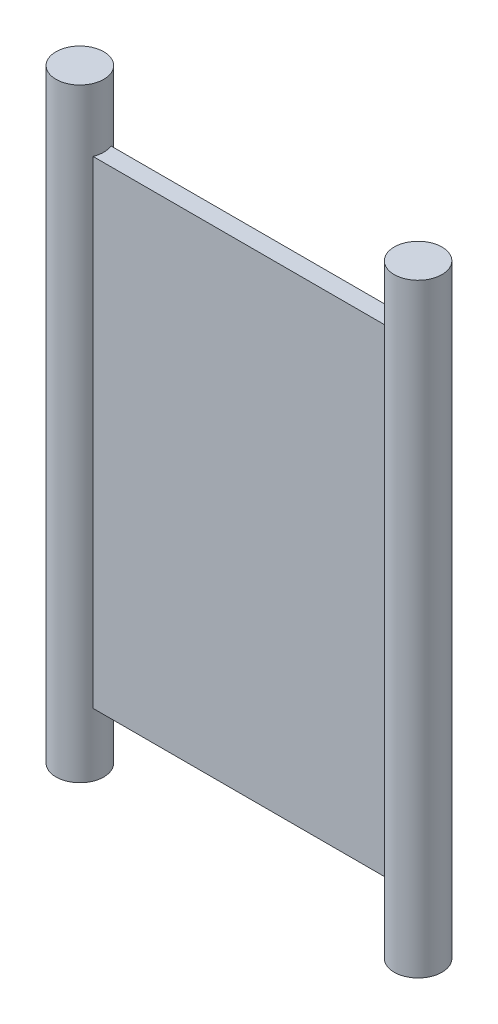
ISO-10303-21;
HEADER;
FILE_DESCRIPTION(('STEP AP214'),'2;1');
FILE_NAME('part.step','',(''),(''),'','','');
FILE_SCHEMA(('AUTOMOTIVE_DESIGN { 1 0 10303 214 1 1 1 1 }'));
ENDSEC;
DATA;
#1=APPLICATION_CONTEXT('core data for automotive mechanical design processes');
#2=APPLICATION_PROTOCOL_DEFINITION('international standard','automotive_design',2000,#1);
#3=PRODUCT_CONTEXT('',#1,'mechanical');
#4=PRODUCT('Part','Part','',(#3));
#5=PRODUCT_RELATED_PRODUCT_CATEGORY('part','',(#4));
#6=PRODUCT_DEFINITION_FORMATION('','',#4);
#7=PRODUCT_DEFINITION_CONTEXT('part definition',#1,'design');
#8=PRODUCT_DEFINITION('design','',#6,#7);
#9=PRODUCT_DEFINITION_SHAPE('','',#8);
#10=(LENGTH_UNIT() NAMED_UNIT(*) SI_UNIT(.MILLI.,.METRE.));
#11=(NAMED_UNIT(*) PLANE_ANGLE_UNIT() SI_UNIT($,.RADIAN.));
#12=(NAMED_UNIT(*) SI_UNIT($,.STERADIAN.) SOLID_ANGLE_UNIT());
#13=UNCERTAINTY_MEASURE_WITH_UNIT(LENGTH_MEASURE(1.E-05),#10,'distance_accuracy_value','');
#14=(GEOMETRIC_REPRESENTATION_CONTEXT(3) GLOBAL_UNCERTAINTY_ASSIGNED_CONTEXT((#13)) GLOBAL_UNIT_ASSIGNED_CONTEXT((#10,
#11,#12)) REPRESENTATION_CONTEXT('',''));
#15=CARTESIAN_POINT('',(0.,0.,0.));
#16=DIRECTION('',(0.,0.,1.));
#17=DIRECTION('',(1.,0.,0.));
#18=AXIS2_PLACEMENT_3D('',#15,#16,#17);
#19=CARTESIAN_POINT('',(9.375,26.5,0.499999999999999));
#20=DIRECTION('',(0.,0.,-1.));
#21=DIRECTION('',(-1.,0.,0.));
#22=AXIS2_PLACEMENT_3D('',#19,#20,#21);
#23=PLANE('',#22);
#24=DIRECTION('',(0.,-1.,0.));
#25=VECTOR('',#24,1.);
#26=CARTESIAN_POINT('',(8.1479608808192,30.,0.499999999999999));
#27=LINE('',#26,#25);
#28=CARTESIAN_POINT('',(8.1479608808192,26.5,0.499999999999999));
#29=VERTEX_POINT('',#28);
#30=CARTESIAN_POINT('',(8.1479608808192,0.,0.499999999999999));
#31=VERTEX_POINT('',#30);
#32=EDGE_CURVE('E53',#29,#31,#27,.T.);
#33=ORIENTED_EDGE('',*,*,#32,.F.);
#34=DIRECTION('',(1.,0.,0.));
#35=VECTOR('',#34,1.);
#36=CARTESIAN_POINT('',(9.375,26.5,0.499999999999999));
#37=LINE('',#36,#35);
#38=CARTESIAN_POINT('',(-8.14796088081919,26.5,0.500000000000001));
#39=VERTEX_POINT('',#38);
#40=EDGE_CURVE('E90',#39,#29,#37,.T.);
#41=ORIENTED_EDGE('',*,*,#40,.F.);
#42=DIRECTION('',(0.,-1.,0.));
#43=VECTOR('',#42,1.);
#44=CARTESIAN_POINT('',(-8.14796088081919,30.,0.500000000000001));
#45=LINE('',#44,#43);
#46=CARTESIAN_POINT('',(-8.14796088081919,0.,0.500000000000001));
#47=VERTEX_POINT('',#46);
#48=EDGE_CURVE('E103',#47,#39,#45,.F.);
#49=ORIENTED_EDGE('',*,*,#48,.F.);
#50=DIRECTION('',(1.,0.,0.));
#51=VECTOR('',#50,1.);
#52=CARTESIAN_POINT('',(9.375,0.,0.499999999999999));
#53=LINE('',#52,#51);
#54=EDGE_CURVE('E91',#47,#31,#53,.T.);
#55=ORIENTED_EDGE('',*,*,#54,.T.);
#56=EDGE_LOOP('',(#33,#41,#49,#55));
#57=FACE_BOUND('',#56,.T.);
#58=ADVANCED_FACE('F39',(#57),#23,.F.);
#59=CARTESIAN_POINT('',(9.375,26.5,-0.500000000000001));
#60=DIRECTION('',(0.,0.,1.));
#61=DIRECTION('',(1.,0.,0.));
#62=AXIS2_PLACEMENT_3D('',#59,#60,#61);
#63=PLANE('',#62);
#64=DIRECTION('',(0.,-1.,0.));
#65=VECTOR('',#64,1.);
#66=CARTESIAN_POINT('',(8.1479608808192,30.,-0.500000000000001));
#67=LINE('',#66,#65);
#68=CARTESIAN_POINT('',(8.1479608808192,0.,-0.500000000000001));
#69=VERTEX_POINT('',#68);
#70=CARTESIAN_POINT('',(8.1479608808192,26.5,-0.500000000000001));
#71=VERTEX_POINT('',#70);
#72=EDGE_CURVE('E78',#69,#71,#67,.F.);
#73=ORIENTED_EDGE('',*,*,#72,.F.);
#74=DIRECTION('',(-1.,0.,0.));
#75=VECTOR('',#74,1.);
#76=CARTESIAN_POINT('',(9.375,0.,-0.500000000000001));
#77=LINE('',#76,#75);
#78=CARTESIAN_POINT('',(-8.14796088081919,0.,-0.499999999999999));
#79=VERTEX_POINT('',#78);
#80=EDGE_CURVE('E60',#69,#79,#77,.T.);
#81=ORIENTED_EDGE('',*,*,#80,.T.);
#82=DIRECTION('',(0.,-1.,0.));
#83=VECTOR('',#82,1.);
#84=CARTESIAN_POINT('',(-8.14796088081919,30.,-0.499999999999999));
#85=LINE('',#84,#83);
#86=CARTESIAN_POINT('',(-8.14796088081919,26.5,-0.499999999999999));
#87=VERTEX_POINT('',#86);
#88=EDGE_CURVE('E105',#87,#79,#85,.T.);
#89=ORIENTED_EDGE('',*,*,#88,.F.);
#90=DIRECTION('',(-1.,0.,0.));
#91=VECTOR('',#90,1.);
#92=CARTESIAN_POINT('',(9.375,26.5,-0.500000000000001));
#93=LINE('',#92,#91);
#94=EDGE_CURVE('E85',#71,#87,#93,.T.);
#95=ORIENTED_EDGE('',*,*,#94,.F.);
#96=EDGE_LOOP('',(#73,#81,#89,#95));
#97=FACE_BOUND('',#96,.T.);
#98=ADVANCED_FACE('F84',(#97),#63,.F.);
#99=CARTESIAN_POINT('',(-9.375,30.,0.));
#100=DIRECTION('',(0.,-1.,0.));
#101=DIRECTION('',(0.,0.,-1.));
#102=AXIS2_PLACEMENT_3D('',#99,#100,#101);
#103=CYLINDRICAL_SURFACE('',#102,1.325);
#104=CARTESIAN_POINT('',(-9.375,30.,0.));
#105=DIRECTION('',(0.,1.,0.));
#106=DIRECTION('',(0.,0.,1.));
#107=AXIS2_PLACEMENT_3D('',#104,#105,#106);
#108=CIRCLE('',#107,1.325);
#109=CARTESIAN_POINT('',(-9.375,30.,1.325));
#110=VERTEX_POINT('',#109);
#111=EDGE_CURVE('E107',#110,#110,#108,.T.);
#112=ORIENTED_EDGE('',*,*,#111,.F.);
#113=EDGE_LOOP('',(#112));
#114=FACE_BOUND('',#113,.T.);
#115=CARTESIAN_POINT('',(-9.375,-3.5,0.));
#116=DIRECTION('',(0.,1.,0.));
#117=DIRECTION('',(0.,0.,1.));
#118=AXIS2_PLACEMENT_3D('',#115,#116,#117);
#119=CIRCLE('',#118,1.325);
#120=CARTESIAN_POINT('',(-9.375,-3.5,1.325));
#121=VERTEX_POINT('',#120);
#122=EDGE_CURVE('E108',#121,#121,#119,.T.);
#123=ORIENTED_EDGE('',*,*,#122,.T.);
#124=EDGE_LOOP('',(#123));
#125=FACE_BOUND('',#124,.T.);
#126=ORIENTED_EDGE('',*,*,#48,.T.);
#127=CARTESIAN_POINT('',(-9.375,26.5,0.));
#128=DIRECTION('',(0.,-1.,0.));
#129=DIRECTION('',(0.,0.,-1.));
#130=AXIS2_PLACEMENT_3D('',#127,#128,#129);
#131=CIRCLE('',#130,1.325);
#132=EDGE_CURVE('E95',#39,#87,#131,.F.);
#133=ORIENTED_EDGE('',*,*,#132,.T.);
#134=ORIENTED_EDGE('',*,*,#88,.T.);
#135=CARTESIAN_POINT('',(-9.375,0.,0.));
#136=DIRECTION('',(0.,-1.,0.));
#137=DIRECTION('',(0.,0.,-1.));
#138=AXIS2_PLACEMENT_3D('',#135,#136,#137);
#139=CIRCLE('',#138,1.325);
#140=EDGE_CURVE('E46',#47,#79,#139,.F.);
#141=ORIENTED_EDGE('',*,*,#140,.F.);
#142=EDGE_LOOP('',(#126,#133,#134,#141));
#143=FACE_BOUND('',#142,.T.);
#144=ADVANCED_FACE('F138',(#114,#125,#143),#103,.T.);
#145=CARTESIAN_POINT('',(-9.375,30.,0.));
#146=DIRECTION('',(0.,1.,0.));
#147=DIRECTION('',(0.,0.,1.));
#148=AXIS2_PLACEMENT_3D('',#145,#146,#147);
#149=PLANE('',#148);
#150=ORIENTED_EDGE('',*,*,#111,.T.);
#151=EDGE_LOOP('',(#150));
#152=FACE_BOUND('',#151,.T.);
#153=ADVANCED_FACE('F144',(#152),#149,.T.);
#154=CARTESIAN_POINT('',(-9.375,-3.5,0.));
#155=DIRECTION('',(0.,1.,0.));
#156=DIRECTION('',(0.,0.,1.));
#157=AXIS2_PLACEMENT_3D('',#154,#155,#156);
#158=PLANE('',#157);
#159=ORIENTED_EDGE('',*,*,#122,.F.);
#160=EDGE_LOOP('',(#159));
#161=FACE_BOUND('',#160,.T.);
#162=ADVANCED_FACE('F150',(#161),#158,.F.);
#163=CARTESIAN_POINT('',(0.,26.5,0.));
#164=DIRECTION('',(0.,-1.,0.));
#165=DIRECTION('',(0.,0.,-1.));
#166=AXIS2_PLACEMENT_3D('',#163,#164,#165);
#167=PLANE('',#166);
#168=CARTESIAN_POINT('',(9.375,26.5,0.));
#169=DIRECTION('',(0.,-1.,0.));
#170=DIRECTION('',(0.,0.,-1.));
#171=AXIS2_PLACEMENT_3D('',#168,#169,#170);
#172=CIRCLE('',#171,1.325);
#173=EDGE_CURVE('E111',#71,#29,#172,.F.);
#174=ORIENTED_EDGE('',*,*,#173,.F.);
#175=ORIENTED_EDGE('',*,*,#94,.T.);
#176=ORIENTED_EDGE('',*,*,#132,.F.);
#177=ORIENTED_EDGE('',*,*,#40,.T.);
#178=EDGE_LOOP('',(#174,#175,#176,#177));
#179=FACE_BOUND('',#178,.T.);
#180=ADVANCED_FACE('F141',(#179),#167,.F.);
#181=CARTESIAN_POINT('',(0.,0.,0.));
#182=DIRECTION('',(0.,-1.,0.));
#183=DIRECTION('',(0.,0.,-1.));
#184=AXIS2_PLACEMENT_3D('',#181,#182,#183);
#185=PLANE('',#184);
#186=ORIENTED_EDGE('',*,*,#80,.F.);
#187=CARTESIAN_POINT('',(9.375,0.,0.));
#188=DIRECTION('',(0.,-1.,0.));
#189=DIRECTION('',(0.,0.,-1.));
#190=AXIS2_PLACEMENT_3D('',#187,#188,#189);
#191=CIRCLE('',#190,1.325);
#192=EDGE_CURVE('E11',#69,#31,#191,.F.);
#193=ORIENTED_EDGE('',*,*,#192,.T.);
#194=ORIENTED_EDGE('',*,*,#54,.F.);
#195=ORIENTED_EDGE('',*,*,#140,.T.);
#196=EDGE_LOOP('',(#186,#193,#194,#195));
#197=FACE_BOUND('',#196,.T.);
#198=ADVANCED_FACE('F89',(#197),#185,.T.);
#199=CARTESIAN_POINT('',(9.375,30.,0.));
#200=DIRECTION('',(0.,-1.,0.));
#201=DIRECTION('',(0.,0.,-1.));
#202=AXIS2_PLACEMENT_3D('',#199,#200,#201);
#203=CYLINDRICAL_SURFACE('',#202,1.325);
#204=CARTESIAN_POINT('',(9.375,30.,0.));
#205=DIRECTION('',(0.,1.,0.));
#206=DIRECTION('',(0.,0.,1.));
#207=AXIS2_PLACEMENT_3D('',#204,#205,#206);
#208=CIRCLE('',#207,1.325);
#209=CARTESIAN_POINT('',(9.375,30.,1.325));
#210=VERTEX_POINT('',#209);
#211=EDGE_CURVE('E116',#210,#210,#208,.T.);
#212=ORIENTED_EDGE('',*,*,#211,.F.);
#213=EDGE_LOOP('',(#212));
#214=FACE_BOUND('',#213,.T.);
#215=CARTESIAN_POINT('',(9.375,-3.5,0.));
#216=DIRECTION('',(0.,1.,0.));
#217=DIRECTION('',(0.,0.,1.));
#218=AXIS2_PLACEMENT_3D('',#215,#216,#217);
#219=CIRCLE('',#218,1.325);
#220=CARTESIAN_POINT('',(9.375,-3.5,1.325));
#221=VERTEX_POINT('',#220);
#222=EDGE_CURVE('E86',#221,#221,#219,.T.);
#223=ORIENTED_EDGE('',*,*,#222,.T.);
#224=EDGE_LOOP('',(#223));
#225=FACE_BOUND('',#224,.T.);
#226=ORIENTED_EDGE('',*,*,#72,.T.);
#227=ORIENTED_EDGE('',*,*,#173,.T.);
#228=ORIENTED_EDGE('',*,*,#32,.T.);
#229=ORIENTED_EDGE('',*,*,#192,.F.);
#230=EDGE_LOOP('',(#226,#227,#228,#229));
#231=FACE_BOUND('',#230,.T.);
#232=ADVANCED_FACE('F77',(#214,#225,#231),#203,.T.);
#233=CARTESIAN_POINT('',(9.375,30.,0.));
#234=DIRECTION('',(0.,1.,0.));
#235=DIRECTION('',(0.,0.,1.));
#236=AXIS2_PLACEMENT_3D('',#233,#234,#235);
#237=PLANE('',#236);
#238=ORIENTED_EDGE('',*,*,#211,.T.);
#239=EDGE_LOOP('',(#238));
#240=FACE_BOUND('',#239,.T.);
#241=ADVANCED_FACE('F125',(#240),#237,.T.);
#242=CARTESIAN_POINT('',(9.375,-3.5,0.));
#243=DIRECTION('',(0.,1.,0.));
#244=DIRECTION('',(0.,0.,1.));
#245=AXIS2_PLACEMENT_3D('',#242,#243,#244);
#246=PLANE('',#245);
#247=ORIENTED_EDGE('',*,*,#222,.F.);
#248=EDGE_LOOP('',(#247));
#249=FACE_BOUND('',#248,.T.);
#250=ADVANCED_FACE('F123',(#249),#246,.F.);
#251=CLOSED_SHELL('',(#58,#98,#144,#153,#162,#180,#198,#232,#241,#250));
#252=MANIFOLD_SOLID_BREP('B2',#251);
#253=ADVANCED_BREP_SHAPE_REPRESENTATION('',(#18,#252),#14);
#254=SHAPE_DEFINITION_REPRESENTATION(#9,#253);
ENDSEC;
END-ISO-10303-21;
